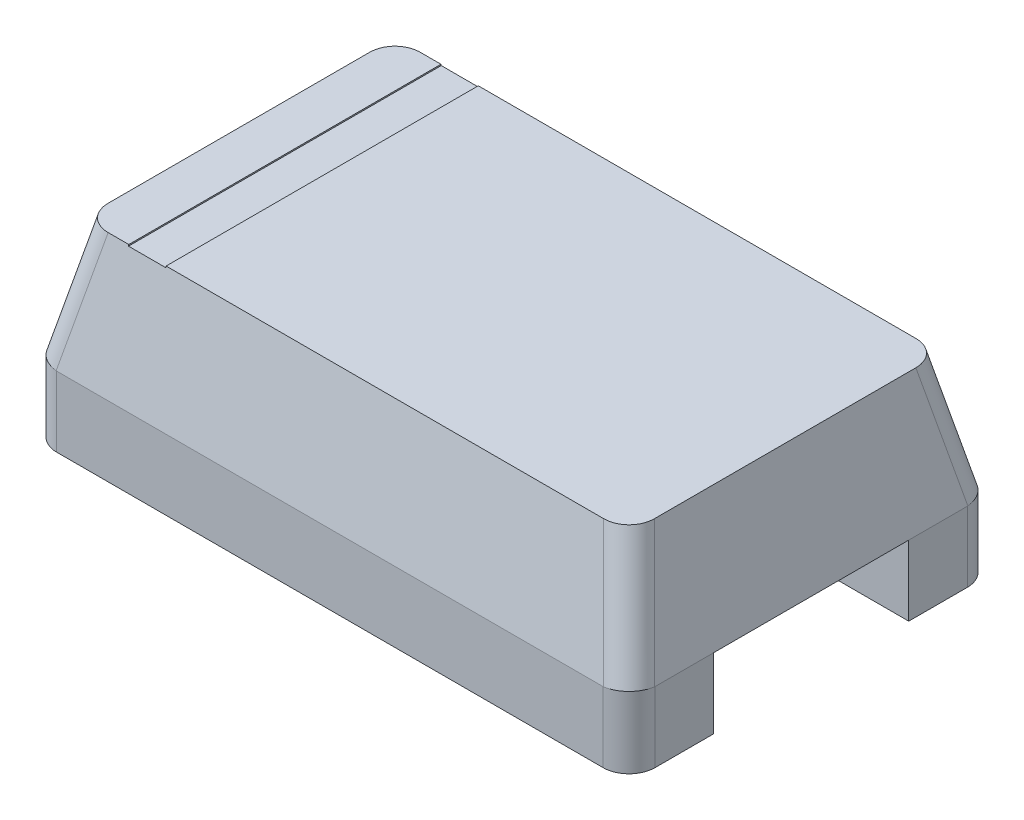
ISO-10303-21;
HEADER;
FILE_DESCRIPTION(('STEP AP214'),'2;1');
FILE_NAME('part.step','',(''),(''),'','','');
FILE_SCHEMA(('AUTOMOTIVE_DESIGN { 1 0 10303 214 1 1 1 1 }'));
ENDSEC;
DATA;
#1=APPLICATION_CONTEXT('core data for automotive mechanical design processes');
#2=APPLICATION_PROTOCOL_DEFINITION('international standard','automotive_design',2000,#1);
#3=PRODUCT_CONTEXT('',#1,'mechanical');
#4=PRODUCT('Part','Part','',(#3));
#5=PRODUCT_RELATED_PRODUCT_CATEGORY('part','',(#4));
#6=PRODUCT_DEFINITION_FORMATION('','',#4);
#7=PRODUCT_DEFINITION_CONTEXT('part definition',#1,'design');
#8=PRODUCT_DEFINITION('design','',#6,#7);
#9=PRODUCT_DEFINITION_SHAPE('','',#8);
#10=(LENGTH_UNIT() NAMED_UNIT(*) SI_UNIT(.MILLI.,.METRE.));
#11=(NAMED_UNIT(*) PLANE_ANGLE_UNIT() SI_UNIT($,.RADIAN.));
#12=(NAMED_UNIT(*) SI_UNIT($,.STERADIAN.) SOLID_ANGLE_UNIT());
#13=UNCERTAINTY_MEASURE_WITH_UNIT(LENGTH_MEASURE(1.E-05),#10,'distance_accuracy_value','');
#14=(GEOMETRIC_REPRESENTATION_CONTEXT(3) GLOBAL_UNCERTAINTY_ASSIGNED_CONTEXT((#13)) GLOBAL_UNIT_ASSIGNED_CONTEXT((#10,
#11,#12)) REPRESENTATION_CONTEXT('',''));
#15=CARTESIAN_POINT('',(0.,0.,0.));
#16=DIRECTION('',(0.,0.,1.));
#17=DIRECTION('',(1.,0.,0.));
#18=AXIS2_PLACEMENT_3D('',#15,#16,#17);
#19=CARTESIAN_POINT('',(5.08935,3.7056,1.104925));
#20=DIRECTION('',(0.,1.,0.));
#21=DIRECTION('',(1.,0.,0.));
#22=AXIS2_PLACEMENT_3D('',#19,#20,#21);
#23=PLANE('',#22);
#24=CARTESIAN_POINT('',(6.13935,3.7056,0.602642636392233));
#25=CARTESIAN_POINT('',(6.13935000000004,3.70559999999999,0.544878720635177));
#26=CARTESIAN_POINT('',(6.0993962793648,3.70559999999999,0.504924999999953));
#27=CARTESIAN_POINT('',(6.0416323636077,3.7056,0.504924999999953));
#28=(BOUNDED_CURVE() B_SPLINE_CURVE(3,(#24,#25,#26,#27),.UNSPECIFIED.,.F.,
.F.) B_SPLINE_CURVE_WITH_KNOTS((4,4),(2.37876533201006,3.90441997516953),
.UNSPECIFIED.) CURVE() GEOMETRIC_REPRESENTATION_ITEM() RATIONAL_B_SPLINE_CURVE((1.,
0.815256875860941,0.815256875860941,1.)) REPRESENTATION_ITEM(''));
#29=CARTESIAN_POINT('',(6.13935,3.7056,0.602642636392233));
#30=VERTEX_POINT('',#29);
#31=CARTESIAN_POINT('',(6.0416323636077,3.7056,0.504924999999953));
#32=VERTEX_POINT('',#31);
#33=EDGE_CURVE('E11',#30,#32,#28,.T.);
#34=ORIENTED_EDGE('',*,*,#33,.T.);
#35=DIRECTION('',(-1.,0.,0.));
#36=VECTOR('',#35,1.);
#37=CARTESIAN_POINT('',(5.08935,3.7056,0.504924999999953));
#38=LINE('',#37,#36);
#39=CARTESIAN_POINT('',(4.3597501776646,3.7056,0.504924999999953));
#40=VERTEX_POINT('',#39);
#41=EDGE_CURVE('E26',#32,#40,#38,.T.);
#42=ORIENTED_EDGE('',*,*,#41,.T.);
#43=DIRECTION('',(0.,0.,1.));
#44=VECTOR('',#43,1.);
#45=CARTESIAN_POINT('',(4.3597501776646,3.7056,1.104925));
#46=LINE('',#45,#44);
#47=CARTESIAN_POINT('',(4.3597501776646,3.7056,1.704925));
#48=VERTEX_POINT('',#47);
#49=EDGE_CURVE('E511',#40,#48,#46,.T.);
#50=ORIENTED_EDGE('',*,*,#49,.T.);
#51=DIRECTION('',(-1.,0.,0.));
#52=VECTOR('',#51,1.);
#53=CARTESIAN_POINT('',(3.93935,3.7056,1.704925));
#54=LINE('',#53,#52);
#55=CARTESIAN_POINT('',(6.0416323636077,3.7056,1.704925));
#56=VERTEX_POINT('',#55);
#57=EDGE_CURVE('E505',#56,#48,#54,.T.);
#58=ORIENTED_EDGE('',*,*,#57,.F.);
#59=CARTESIAN_POINT('',(6.0416323636077,3.7056,1.704925));
#60=CARTESIAN_POINT('',(6.0993962793648,3.70559999999999,1.70492499999998));
#61=CARTESIAN_POINT('',(6.13935000000004,3.70559999999999,1.66497127936475));
#62=CARTESIAN_POINT('',(6.13935,3.7056,1.6072073636077));
#63=(BOUNDED_CURVE() B_SPLINE_CURVE(3,(#59,#60,#61,#62),.UNSPECIFIED.,.F.,
.F.) B_SPLINE_CURVE_WITH_KNOTS((4,4),(2.37876533201006,3.90441997516953),
.UNSPECIFIED.) CURVE() GEOMETRIC_REPRESENTATION_ITEM() RATIONAL_B_SPLINE_CURVE((1.,
0.815256875860941,0.815256875860941,1.)) REPRESENTATION_ITEM(''));
#64=CARTESIAN_POINT('',(6.13935,3.7056,1.6072073636077));
#65=VERTEX_POINT('',#64);
#66=EDGE_CURVE('E501',#56,#65,#63,.T.);
#67=ORIENTED_EDGE('',*,*,#66,.T.);
#68=DIRECTION('',(0.,0.,-1.));
#69=VECTOR('',#68,1.);
#70=CARTESIAN_POINT('',(6.13935,3.7056,1.104925));
#71=LINE('',#70,#69);
#72=EDGE_CURVE('E499',#65,#30,#71,.T.);
#73=ORIENTED_EDGE('',*,*,#72,.T.);
#74=EDGE_LOOP('',(#34,#42,#50,#58,#67,#73));
#75=FACE_BOUND('',#74,.T.);
#76=ADVANCED_FACE('F17',(#75),#23,.T.);
#77=CARTESIAN_POINT('',(5.61435,3.7056,0.504924999999953));
#78=DIRECTION('',(0.,-0.212429644331044,0.977176363922801));
#79=DIRECTION('',(0.,-0.977176363922801,-0.212429644331044));
#80=AXIS2_PLACEMENT_3D('',#77,#78,#79);
#81=PLANE('',#80);
#82=DIRECTION('',(1.,0.,0.));
#83=VECTOR('',#82,1.);
#84=CARTESIAN_POINT('',(5.61435,3.2456,0.404924999999952));
#85=LINE('',#84,#83);
#86=CARTESIAN_POINT('',(4.03935,3.2456,0.404924999999952));
#87=VERTEX_POINT('',#86);
#88=CARTESIAN_POINT('',(6.13935,3.2456,0.404924999999952));
#89=VERTEX_POINT('',#88);
#90=EDGE_CURVE('E494',#87,#89,#85,.T.);
#91=ORIENTED_EDGE('',*,*,#90,.F.);
#92=CARTESIAN_POINT('',(4.0370931074559,3.2457171668928,0.404950471063605));
#93=CARTESIAN_POINT('',(4.03784529318196,3.24563905728904,0.404933490714961));
#94=CARTESIAN_POINT('',(4.0385976226354,3.24560000000003,0.404924999999952));
#95=CARTESIAN_POINT('',(4.03935,3.2456,0.404924999999952));
#96=(BOUNDED_CURVE() B_SPLINE_CURVE(3,(#92,#93,#94,#95),.UNSPECIFIED.,.F.,
.F.) B_SPLINE_CURVE_WITH_KNOTS((4,4),(3.11902181177206,3.14159265358979),
.UNSPECIFIED.) CURVE() GEOMETRIC_REPRESENTATION_ITEM() RATIONAL_B_SPLINE_CURVE((1.,
0.999957546875544,0.999957546875544,1.)) REPRESENTATION_ITEM(''));
#97=CARTESIAN_POINT('',(4.0370931074559,3.2457171668928,0.404950471063605));
#98=VERTEX_POINT('',#97);
#99=EDGE_CURVE('E489',#98,#87,#96,.T.);
#100=ORIENTED_EDGE('',*,*,#99,.F.);
#101=DIRECTION('',(-0.207792908730851,-0.955847380161889,-0.207792908730846));
#102=VECTOR('',#101,1.);
#103=CARTESIAN_POINT('',(4.1370676363923,3.7056,0.504924999999953));
#104=LINE('',#103,#102);
#105=CARTESIAN_POINT('',(4.1370676363923,3.7056,0.504924999999952));
#106=VERTEX_POINT('',#105);
#107=EDGE_CURVE('E486',#106,#98,#104,.T.);
#108=ORIENTED_EDGE('',*,*,#107,.F.);
#109=DIRECTION('',(-1.,0.,0.));
#110=VECTOR('',#109,1.);
#111=CARTESIAN_POINT('',(5.61435,3.7056,0.504924999999953));
#112=LINE('',#111,#110);
#113=CARTESIAN_POINT('',(4.2163599227639,3.7056,0.504924999999953));
#114=VERTEX_POINT('',#113);
#115=EDGE_CURVE('E483',#114,#106,#112,.T.);
#116=ORIENTED_EDGE('',*,*,#115,.F.);
#117=DIRECTION('',(0.,0.977176363922801,0.212429644331044));
#118=VECTOR('',#117,1.);
#119=CARTESIAN_POINT('',(4.2163599227639,3.7056,0.504924999999953));
#120=LINE('',#119,#118);
#121=CARTESIAN_POINT('',(4.2163599227639,3.7006,0.503838043478213));
#122=VERTEX_POINT('',#121);
#123=EDGE_CURVE('E480',#122,#114,#120,.T.);
#124=ORIENTED_EDGE('',*,*,#123,.F.);
#125=DIRECTION('',(-1.,0.,0.));
#126=VECTOR('',#125,1.);
#127=CARTESIAN_POINT('',(5.61435,3.7006,0.503838043478213));
#128=LINE('',#127,#126);
#129=CARTESIAN_POINT('',(4.3597501776646,3.7006,0.503838043478213));
#130=VERTEX_POINT('',#129);
#131=EDGE_CURVE('E477',#130,#122,#128,.T.);
#132=ORIENTED_EDGE('',*,*,#131,.F.);
#133=DIRECTION('',(0.,-0.977176363922801,-0.212429644331044));
#134=VECTOR('',#133,1.);
#135=CARTESIAN_POINT('',(4.3597501776646,3.7056,0.504924999999953));
#136=LINE('',#135,#134);
#137=EDGE_CURVE('E474',#40,#130,#136,.T.);
#138=ORIENTED_EDGE('',*,*,#137,.F.);
#139=ORIENTED_EDGE('',*,*,#41,.F.);
#140=DIRECTION('',(-0.207792908730851,0.955847380161889,0.207792908730846));
#141=VECTOR('',#140,1.);
#142=CARTESIAN_POINT('',(6.1416068925441,3.2457171668928,0.404950471063605));
#143=LINE('',#142,#141);
#144=CARTESIAN_POINT('',(6.1416068925441,3.2457171668928,0.404950471063605));
#145=VERTEX_POINT('',#144);
#146=EDGE_CURVE('E469',#145,#32,#143,.T.);
#147=ORIENTED_EDGE('',*,*,#146,.F.);
#148=CARTESIAN_POINT('',(6.13935,3.2456,0.404924999999952));
#149=CARTESIAN_POINT('',(6.1401023773646,3.24560000000003,0.404924999999952));
#150=CARTESIAN_POINT('',(6.14085470681803,3.24563905728904,0.404933490714961));
#151=CARTESIAN_POINT('',(6.1416068925441,3.2457171668928,0.404950471063605));
#152=(BOUNDED_CURVE() B_SPLINE_CURVE(3,(#148,#149,#150,#151),.UNSPECIFIED.,.F.,
.F.) B_SPLINE_CURVE_WITH_KNOTS((4,4),(3.14159265358979,3.16416349540752),
.UNSPECIFIED.) CURVE() GEOMETRIC_REPRESENTATION_ITEM() RATIONAL_B_SPLINE_CURVE((1.,
0.999957546875544,0.999957546875544,1.)) REPRESENTATION_ITEM(''));
#153=EDGE_CURVE('E464',#89,#145,#152,.T.);
#154=ORIENTED_EDGE('',*,*,#153,.F.);
#155=EDGE_LOOP('',(#91,#100,#108,#116,#124,#132,#138,#139,#147,#154));
#156=FACE_BOUND('',#155,.T.);
#157=ADVANCED_FACE('F519',(#156),#81,.F.);
#158=CARTESIAN_POINT('',(6.0150873565435,3.8064640680624,0.62918764345647));
#159=DIRECTION('',(-0.207792908730846,0.95584738016189,0.207792908730845));
#160=DIRECTION('',(0.977176363922801,0.212429644331044,0.));
#161=AXIS2_PLACEMENT_3D('',#158,#159,#160);
#162=CYLINDRICAL_SURFACE('',#161,0.0999999999999997);
#163=ORIENTED_EDGE('',*,*,#146,.T.);
#164=ORIENTED_EDGE('',*,*,#33,.F.);
#165=DIRECTION('',(0.207792908730846,-0.95584738016189,-0.207792908730845));
#166=VECTOR('',#165,1.);
#167=CARTESIAN_POINT('',(6.1128049929358,3.8277070324955,0.62918764345647));
#168=LINE('',#167,#166);
#169=CARTESIAN_POINT('',(6.2393245289363,3.2457171668928,0.502668107455886));
#170=VERTEX_POINT('',#169);
#171=EDGE_CURVE('E459',#30,#170,#168,.T.);
#172=ORIENTED_EDGE('',*,*,#171,.T.);
#173=CARTESIAN_POINT('',(6.2393245289363,3.2457171668928,0.502668107455886));
#174=CARTESIAN_POINT('',(6.23804931482998,3.25158315178215,0.446179405805221));
#175=CARTESIAN_POINT('',(6.19809559419475,3.25158315178215,0.406225685169997));
#176=CARTESIAN_POINT('',(6.1416068925441,3.2457171668928,0.404950471063605));
#177=(BOUNDED_CURVE() B_SPLINE_CURVE(3,(#173,#174,#175,#176),.UNSPECIFIED.,.F.,
.F.) B_SPLINE_CURVE_WITH_KNOTS((4,4),(2.37876533201005,3.90441997516951),
.UNSPECIFIED.) CURVE() GEOMETRIC_REPRESENTATION_ITEM() RATIONAL_B_SPLINE_CURVE((1.,
0.815256875860945,0.815256875860945,1.)) REPRESENTATION_ITEM(''));
#178=EDGE_CURVE('E451',#170,#145,#177,.T.);
#179=ORIENTED_EDGE('',*,*,#178,.T.);
#180=EDGE_LOOP('',(#163,#164,#172,#179));
#181=FACE_BOUND('',#180,.T.);
#182=ADVANCED_FACE('F540',(#181),#162,.T.);
#183=CARTESIAN_POINT('',(6.13935,3.7056,1.404925));
#184=DIRECTION('',(-0.977176363922801,-0.212429644331044,0.));
#185=DIRECTION('',(-0.212429644331044,0.977176363922801,0.));
#186=AXIS2_PLACEMENT_3D('',#183,#184,#185);
#187=PLANE('',#186);
#188=CARTESIAN_POINT('',(6.23935,3.2456,1.704925));
#189=CARTESIAN_POINT('',(6.23934999999997,3.24560000000003,1.70567737736458));
#190=CARTESIAN_POINT('',(6.23934150928501,3.24563905728904,1.70642970681792));
#191=CARTESIAN_POINT('',(6.2393245289363,3.2457171668928,1.707181892544));
#192=(BOUNDED_CURVE() B_SPLINE_CURVE(3,(#188,#189,#190,#191),.UNSPECIFIED.,.F.,
.F.) B_SPLINE_CURVE_WITH_KNOTS((4,4),(3.14159265358979,3.1641634954075),
.UNSPECIFIED.) CURVE() GEOMETRIC_REPRESENTATION_ITEM() RATIONAL_B_SPLINE_CURVE((1.,
0.999957546875545,0.999957546875545,1.)) REPRESENTATION_ITEM(''));
#193=CARTESIAN_POINT('',(6.23935,3.2456,1.704925));
#194=VERTEX_POINT('',#193);
#195=CARTESIAN_POINT('',(6.2393245289363,3.2457171668928,1.707181892544));
#196=VERTEX_POINT('',#195);
#197=EDGE_CURVE('E447',#194,#196,#192,.T.);
#198=ORIENTED_EDGE('',*,*,#197,.F.);
#199=DIRECTION('',(0.,0.,1.));
#200=VECTOR('',#199,1.);
#201=CARTESIAN_POINT('',(6.23935,3.2456,1.404925));
#202=LINE('',#201,#200);
#203=CARTESIAN_POINT('',(6.23935,3.2456,1.479925));
#204=VERTEX_POINT('',#203);
#205=EDGE_CURVE('E444',#204,#194,#202,.T.);
#206=ORIENTED_EDGE('',*,*,#205,.F.);
#207=DIRECTION('',(0.,0.,1.));
#208=VECTOR('',#207,1.);
#209=CARTESIAN_POINT('',(6.23935,3.2456,1.404925));
#210=LINE('',#209,#208);
#211=CARTESIAN_POINT('',(6.23935,3.2456,0.729924999999952));
#212=VERTEX_POINT('',#211);
#213=EDGE_CURVE('E441',#212,#204,#210,.T.);
#214=ORIENTED_EDGE('',*,*,#213,.F.);
#215=DIRECTION('',(0.,0.,1.));
#216=VECTOR('',#215,1.);
#217=CARTESIAN_POINT('',(6.23935,3.2456,1.404925));
#218=LINE('',#217,#216);
#219=CARTESIAN_POINT('',(6.23935,3.2456,0.504924999999952));
#220=VERTEX_POINT('',#219);
#221=EDGE_CURVE('E435',#220,#212,#218,.T.);
#222=ORIENTED_EDGE('',*,*,#221,.F.);
#223=CARTESIAN_POINT('',(6.2393245289363,3.2457171668928,0.502668107455886));
#224=CARTESIAN_POINT('',(6.23934150928501,3.24563905728904,0.503420293181948));
#225=CARTESIAN_POINT('',(6.23934999999997,3.24560000000003,0.504172622635373));
#226=CARTESIAN_POINT('',(6.23935,3.2456,0.504924999999952));
#227=(BOUNDED_CURVE() B_SPLINE_CURVE(3,(#223,#224,#225,#226),.UNSPECIFIED.,.F.,
.F.) B_SPLINE_CURVE_WITH_KNOTS((4,4),(3.11902181177209,3.14159265358979),
.UNSPECIFIED.) CURVE() GEOMETRIC_REPRESENTATION_ITEM() RATIONAL_B_SPLINE_CURVE((1.,
0.999957546875545,0.999957546875545,1.)) REPRESENTATION_ITEM(''));
#228=EDGE_CURVE('E430',#170,#220,#227,.T.);
#229=ORIENTED_EDGE('',*,*,#228,.F.);
#230=ORIENTED_EDGE('',*,*,#171,.F.);
#231=ORIENTED_EDGE('',*,*,#72,.F.);
#232=DIRECTION('',(-0.207792908730846,0.95584738016189,-0.207792908730845));
#233=VECTOR('',#232,1.);
#234=CARTESIAN_POINT('',(6.2393245289363,3.2457171668928,1.707181892544));
#235=LINE('',#234,#233);
#236=EDGE_CURVE('E427',#196,#65,#235,.T.);
#237=ORIENTED_EDGE('',*,*,#236,.F.);
#238=EDGE_LOOP('',(#198,#206,#214,#222,#229,#230,#231,#237));
#239=FACE_BOUND('',#238,.T.);
#240=ADVANCED_FACE('F536',(#239),#187,.F.);
#241=CARTESIAN_POINT('',(5.9918792390996,3.9132214083042,1.5574542390996));
#242=DIRECTION('',(-0.207792908730846,0.95584738016189,-0.207792908730846));
#243=DIRECTION('',(0.977176363922801,0.212429644331044,0.));
#244=AXIS2_PLACEMENT_3D('',#241,#242,#243);
#245=CYLINDRICAL_SURFACE('',#244,0.0999999999999996);
#246=ORIENTED_EDGE('',*,*,#236,.T.);
#247=ORIENTED_EDGE('',*,*,#66,.F.);
#248=DIRECTION('',(-0.207792908730851,0.955847380161889,-0.207792908730845));
#249=VECTOR('',#248,1.);
#250=CARTESIAN_POINT('',(6.1416068925441,3.2457171668928,1.8048995289363));
#251=LINE('',#250,#249);
#252=CARTESIAN_POINT('',(6.1416068925441,3.2457171668928,1.8048995289363));
#253=VERTEX_POINT('',#252);
#254=EDGE_CURVE('E421',#253,#56,#251,.T.);
#255=ORIENTED_EDGE('',*,*,#254,.F.);
#256=CARTESIAN_POINT('',(6.1416068925441,3.2457171668928,1.8048995289363));
#257=CARTESIAN_POINT('',(6.19809559419474,3.25158315178214,1.80362431482994));
#258=CARTESIAN_POINT('',(6.23804931482997,3.25158315178214,1.76367059419471));
#259=CARTESIAN_POINT('',(6.2393245289363,3.2457171668928,1.707181892544));
#260=(BOUNDED_CURVE() B_SPLINE_CURVE(3,(#256,#257,#258,#259),.UNSPECIFIED.,.F.,
.F.) B_SPLINE_CURVE_WITH_KNOTS((4,4),(2.37876533201008,3.90441997516953),
.UNSPECIFIED.) CURVE() GEOMETRIC_REPRESENTATION_ITEM() RATIONAL_B_SPLINE_CURVE((1.,
0.815256875860946,0.815256875860946,1.)) REPRESENTATION_ITEM(''));
#261=EDGE_CURVE('E416',#253,#196,#260,.T.);
#262=ORIENTED_EDGE('',*,*,#261,.T.);
#263=EDGE_LOOP('',(#246,#247,#255,#262));
#264=FACE_BOUND('',#263,.T.);
#265=ADVANCED_FACE('F532',(#264),#245,.T.);
#266=CARTESIAN_POINT('',(4.3597501776646,3.7056,1.104925));
#267=DIRECTION('',(-1.,0.,0.));
#268=DIRECTION('',(0.,1.,0.));
#269=AXIS2_PLACEMENT_3D('',#266,#267,#268);
#270=PLANE('',#269);
#271=DIRECTION('',(0.,0.,1.));
#272=VECTOR('',#271,1.);
#273=CARTESIAN_POINT('',(4.3597501776646,3.7006,1.104925));
#274=LINE('',#273,#272);
#275=CARTESIAN_POINT('',(4.3597501776646,3.7006,1.7060119565217));
#276=VERTEX_POINT('',#275);
#277=EDGE_CURVE('E414',#130,#276,#274,.T.);
#278=ORIENTED_EDGE('',*,*,#277,.T.);
#279=DIRECTION('',(0.,-0.977176363922801,0.212429644331044));
#280=VECTOR('',#279,1.);
#281=CARTESIAN_POINT('',(4.3597501776646,3.7056,1.704925));
#282=LINE('',#281,#280);
#283=EDGE_CURVE('E411',#48,#276,#282,.T.);
#284=ORIENTED_EDGE('',*,*,#283,.F.);
#285=ORIENTED_EDGE('',*,*,#49,.F.);
#286=ORIENTED_EDGE('',*,*,#137,.T.);
#287=EDGE_LOOP('',(#278,#284,#285,#286));
#288=FACE_BOUND('',#287,.T.);
#289=ADVANCED_FACE('F517',(#288),#270,.T.);
#290=CARTESIAN_POINT('',(6.13935,2.9756,0.504924999999953));
#291=DIRECTION('',(0.,1.,0.));
#292=DIRECTION('',(1.,0.,0.));
#293=AXIS2_PLACEMENT_3D('',#290,#291,#292);
#294=CYLINDRICAL_SURFACE('',#293,0.1);
#295=ORIENTED_EDGE('',*,*,#153,.T.);
#296=ORIENTED_EDGE('',*,*,#178,.F.);
#297=ORIENTED_EDGE('',*,*,#228,.T.);
#298=DIRECTION('',(0.,-1.,0.));
#299=VECTOR('',#298,1.);
#300=CARTESIAN_POINT('',(6.23935,2.9756,0.504924999999953));
#301=LINE('',#300,#299);
#302=CARTESIAN_POINT('',(6.23935,2.9756,0.504924999999953));
#303=VERTEX_POINT('',#302);
#304=EDGE_CURVE('E409',#220,#303,#301,.T.);
#305=ORIENTED_EDGE('',*,*,#304,.T.);
#306=CARTESIAN_POINT('',(6.13935,2.9756,0.504924999999953));
#307=DIRECTION('',(0.,1.,0.));
#308=DIRECTION('',(1.,0.,0.));
#309=AXIS2_PLACEMENT_3D('',#306,#307,#308);
#310=CIRCLE('',#309,0.1);
#311=CARTESIAN_POINT('',(6.13935,2.9756,0.404924999999952));
#312=VERTEX_POINT('',#311);
#313=EDGE_CURVE('E407',#303,#312,#310,.T.);
#314=ORIENTED_EDGE('',*,*,#313,.T.);
#315=DIRECTION('',(0.,1.,0.));
#316=VECTOR('',#315,1.);
#317=CARTESIAN_POINT('',(6.13935,2.9756,0.404924999999952));
#318=LINE('',#317,#316);
#319=EDGE_CURVE('E404',#312,#89,#318,.T.);
#320=ORIENTED_EDGE('',*,*,#319,.T.);
#321=EDGE_LOOP('',(#295,#296,#297,#305,#314,#320));
#322=FACE_BOUND('',#321,.T.);
#323=ADVANCED_FACE('F542',(#322),#294,.T.);
#324=CARTESIAN_POINT('',(5.08935,2.9756,0.404924999999952));
#325=DIRECTION('',(0.,0.,-1.));
#326=DIRECTION('',(0.,1.,0.));
#327=AXIS2_PLACEMENT_3D('',#324,#325,#326);
#328=PLANE('',#327);
#329=DIRECTION('',(0.,1.,0.));
#330=VECTOR('',#329,1.);
#331=CARTESIAN_POINT('',(4.03935,2.9756,0.404924999999952));
#332=LINE('',#331,#330);
#333=CARTESIAN_POINT('',(4.03935,2.9756,0.404924999999952));
#334=VERTEX_POINT('',#333);
#335=EDGE_CURVE('E401',#334,#87,#332,.T.);
#336=ORIENTED_EDGE('',*,*,#335,.T.);
#337=ORIENTED_EDGE('',*,*,#90,.T.);
#338=ORIENTED_EDGE('',*,*,#319,.F.);
#339=DIRECTION('',(-1.,0.,0.));
#340=VECTOR('',#339,1.);
#341=CARTESIAN_POINT('',(5.08935,2.9756,0.404924999999952));
#342=LINE('',#341,#340);
#343=EDGE_CURVE('E398',#312,#334,#342,.T.);
#344=ORIENTED_EDGE('',*,*,#343,.T.);
#345=EDGE_LOOP('',(#336,#337,#338,#344));
#346=FACE_BOUND('',#345,.T.);
#347=ADVANCED_FACE('F550',(#346),#328,.T.);
#348=CARTESIAN_POINT('',(4.03935,2.9756,0.504924999999953));
#349=DIRECTION('',(0.,1.,0.));
#350=DIRECTION('',(1.,0.,0.));
#351=AXIS2_PLACEMENT_3D('',#348,#349,#350);
#352=CYLINDRICAL_SURFACE('',#351,0.1);
#353=ORIENTED_EDGE('',*,*,#335,.F.);
#354=CARTESIAN_POINT('',(4.03935,2.9756,0.504924999999953));
#355=DIRECTION('',(0.,1.,0.));
#356=DIRECTION('',(1.,0.,0.));
#357=AXIS2_PLACEMENT_3D('',#354,#355,#356);
#358=CIRCLE('',#357,0.1);
#359=CARTESIAN_POINT('',(3.93935,2.9756,0.504924999999953));
#360=VERTEX_POINT('',#359);
#361=EDGE_CURVE('E396',#334,#360,#358,.T.);
#362=ORIENTED_EDGE('',*,*,#361,.T.);
#363=DIRECTION('',(0.,1.,0.));
#364=VECTOR('',#363,1.);
#365=CARTESIAN_POINT('',(3.93935,2.9756,0.504924999999953));
#366=LINE('',#365,#364);
#367=CARTESIAN_POINT('',(3.93935,3.2456,0.504924999999953));
#368=VERTEX_POINT('',#367);
#369=EDGE_CURVE('E391',#360,#368,#366,.T.);
#370=ORIENTED_EDGE('',*,*,#369,.T.);
#371=CARTESIAN_POINT('',(3.93935,3.2456,0.504924999999953));
#372=CARTESIAN_POINT('',(3.93935000000002,3.24560000000003,0.504172622635373));
#373=CARTESIAN_POINT('',(3.93935849071498,3.24563905728904,0.503420293181948));
#374=CARTESIAN_POINT('',(3.9393754710636,3.2457171668928,0.502668107455886));
#375=(BOUNDED_CURVE() B_SPLINE_CURVE(3,(#371,#372,#373,#374),.UNSPECIFIED.,.F.,
.F.) B_SPLINE_CURVE_WITH_KNOTS((4,4),(3.14159265358979,3.1641634954075),
.UNSPECIFIED.) CURVE() GEOMETRIC_REPRESENTATION_ITEM() RATIONAL_B_SPLINE_CURVE((1.,
0.999957546875545,0.999957546875545,1.)) REPRESENTATION_ITEM(''));
#376=CARTESIAN_POINT('',(3.9393754710636,3.2457171668928,0.502668107455886));
#377=VERTEX_POINT('',#376);
#378=EDGE_CURVE('E384',#368,#377,#375,.T.);
#379=ORIENTED_EDGE('',*,*,#378,.T.);
#380=CARTESIAN_POINT('',(3.9393754710636,3.2457171668928,0.502668107455886));
#381=CARTESIAN_POINT('',(3.94065068517002,3.25158315178215,0.446179405805221));
#382=CARTESIAN_POINT('',(3.98060440580525,3.25158315178215,0.406225685169997));
#383=CARTESIAN_POINT('',(4.0370931074559,3.2457171668928,0.404950471063605));
#384=(BOUNDED_CURVE() B_SPLINE_CURVE(3,(#380,#381,#382,#383),.UNSPECIFIED.,.F.,
.F.) B_SPLINE_CURVE_WITH_KNOTS((4,4),(5.52035798559984,7.04601262875931),
.UNSPECIFIED.) CURVE() GEOMETRIC_REPRESENTATION_ITEM() RATIONAL_B_SPLINE_CURVE((1.,
0.815256875860944,0.815256875860944,1.)) REPRESENTATION_ITEM(''));
#385=EDGE_CURVE('E379',#377,#98,#384,.T.);
#386=ORIENTED_EDGE('',*,*,#385,.T.);
#387=ORIENTED_EDGE('',*,*,#99,.T.);
#388=EDGE_LOOP('',(#353,#362,#370,#379,#386,#387));
#389=FACE_BOUND('',#388,.T.);
#390=ADVANCED_FACE('F548',(#389),#352,.T.);
#391=CARTESIAN_POINT('',(4.1733276693632,3.8511531872334,0.638902669363205));
#392=DIRECTION('',(0.207792908730846,0.95584738016189,0.207792908730846));
#393=DIRECTION('',(0.977176363922801,-0.212429644331044,0.));
#394=AXIS2_PLACEMENT_3D('',#391,#392,#393);
#395=CYLINDRICAL_SURFACE('',#394,0.0999999999999997);
#396=ORIENTED_EDGE('',*,*,#107,.T.);
#397=ORIENTED_EDGE('',*,*,#385,.F.);
#398=DIRECTION('',(0.207792908730846,0.95584738016189,0.207792908730846));
#399=VECTOR('',#398,1.);
#400=CARTESIAN_POINT('',(4.075610032971,3.8723961516665,0.638902669363206));
#401=LINE('',#400,#399);
#402=CARTESIAN_POINT('',(4.03935,3.7056,0.602642636392232));
#403=VERTEX_POINT('',#402);
#404=EDGE_CURVE('E374',#377,#403,#401,.T.);
#405=ORIENTED_EDGE('',*,*,#404,.T.);
#406=CARTESIAN_POINT('',(4.03935,3.7056,0.602642636392232));
#407=CARTESIAN_POINT('',(4.03935000000001,3.7056,0.544878720635176));
#408=CARTESIAN_POINT('',(4.07930372063524,3.7056,0.504924999999952));
#409=CARTESIAN_POINT('',(4.1370676363923,3.7056,0.504924999999952));
#410=(BOUNDED_CURVE() B_SPLINE_CURVE(3,(#406,#407,#408,#409),.UNSPECIFIED.,.F.,
.F.) B_SPLINE_CURVE_WITH_KNOTS((4,4),(2.37876533201005,3.90441997516953),
.UNSPECIFIED.) CURVE() GEOMETRIC_REPRESENTATION_ITEM() RATIONAL_B_SPLINE_CURVE((1.,
0.815256875860941,0.815256875860941,1.)) REPRESENTATION_ITEM(''));
#411=EDGE_CURVE('E366',#403,#106,#410,.T.);
#412=ORIENTED_EDGE('',*,*,#411,.T.);
#413=EDGE_LOOP('',(#396,#397,#405,#412));
#414=FACE_BOUND('',#413,.T.);
#415=ADVANCED_FACE('F567',(#414),#395,.T.);
#416=CARTESIAN_POINT('',(5.08935,3.7056,1.104925));
#417=DIRECTION('',(0.,1.,0.));
#418=DIRECTION('',(1.,0.,0.));
#419=AXIS2_PLACEMENT_3D('',#416,#417,#418);
#420=PLANE('',#419);
#421=CARTESIAN_POINT('',(4.03935,3.7056,1.6072073636077));
#422=CARTESIAN_POINT('',(4.03935,3.70559999999999,1.66497127936475));
#423=CARTESIAN_POINT('',(4.07930372063523,3.70559999999999,1.70492499999998));
#424=CARTESIAN_POINT('',(4.1370676363923,3.7056,1.704925));
#425=(BOUNDED_CURVE() B_SPLINE_CURVE(3,(#421,#422,#423,#424),.UNSPECIFIED.,.F.,
.F.) B_SPLINE_CURVE_WITH_KNOTS((4,4),(2.37876533201006,3.90441997516953),
.UNSPECIFIED.) CURVE() GEOMETRIC_REPRESENTATION_ITEM() RATIONAL_B_SPLINE_CURVE((1.,
0.815256875860942,0.815256875860942,1.)) REPRESENTATION_ITEM(''));
#426=CARTESIAN_POINT('',(4.03935,3.7056,1.6072073636077));
#427=VERTEX_POINT('',#426);
#428=CARTESIAN_POINT('',(4.1370676363923,3.7056,1.704925));
#429=VERTEX_POINT('',#428);
#430=EDGE_CURVE('E362',#427,#429,#425,.T.);
#431=ORIENTED_EDGE('',*,*,#430,.T.);
#432=DIRECTION('',(-1.,0.,0.));
#433=VECTOR('',#432,1.);
#434=CARTESIAN_POINT('',(3.93935,3.7056,1.704925));
#435=LINE('',#434,#433);
#436=CARTESIAN_POINT('',(4.2163599227639,3.7056,1.704925));
#437=VERTEX_POINT('',#436);
#438=EDGE_CURVE('E359',#437,#429,#435,.T.);
#439=ORIENTED_EDGE('',*,*,#438,.F.);
#440=DIRECTION('',(0.,0.,-1.));
#441=VECTOR('',#440,1.);
#442=CARTESIAN_POINT('',(4.2163599227639,3.7056,1.104925));
#443=LINE('',#442,#441);
#444=EDGE_CURVE('E356',#437,#114,#443,.T.);
#445=ORIENTED_EDGE('',*,*,#444,.T.);
#446=ORIENTED_EDGE('',*,*,#115,.T.);
#447=ORIENTED_EDGE('',*,*,#411,.F.);
#448=DIRECTION('',(0.,0.,1.));
#449=VECTOR('',#448,1.);
#450=CARTESIAN_POINT('',(4.03935,3.7056,1.104925));
#451=LINE('',#450,#449);
#452=EDGE_CURVE('E353',#403,#427,#451,.T.);
#453=ORIENTED_EDGE('',*,*,#452,.T.);
#454=EDGE_LOOP('',(#431,#439,#445,#446,#447,#453));
#455=FACE_BOUND('',#454,.T.);
#456=ADVANCED_FACE('F570',(#455),#420,.T.);
#457=CARTESIAN_POINT('',(4.2163599227639,3.7056,1.104925));
#458=DIRECTION('',(1.,0.,0.));
#459=DIRECTION('',(0.,-1.,0.));
#460=AXIS2_PLACEMENT_3D('',#457,#458,#459);
#461=PLANE('',#460);
#462=DIRECTION('',(0.,0.,-1.));
#463=VECTOR('',#462,1.);
#464=CARTESIAN_POINT('',(4.2163599227639,3.7006,1.104925));
#465=LINE('',#464,#463);
#466=CARTESIAN_POINT('',(4.2163599227639,3.7006,1.7060119565217));
#467=VERTEX_POINT('',#466);
#468=EDGE_CURVE('E350',#467,#122,#465,.T.);
#469=ORIENTED_EDGE('',*,*,#468,.T.);
#470=ORIENTED_EDGE('',*,*,#123,.T.);
#471=ORIENTED_EDGE('',*,*,#444,.F.);
#472=DIRECTION('',(0.,0.977176363922801,-0.212429644331044));
#473=VECTOR('',#472,1.);
#474=CARTESIAN_POINT('',(4.2163599227639,3.7056,1.704925));
#475=LINE('',#474,#473);
#476=EDGE_CURVE('E347',#467,#437,#475,.T.);
#477=ORIENTED_EDGE('',*,*,#476,.F.);
#478=EDGE_LOOP('',(#469,#470,#471,#477));
#479=FACE_BOUND('',#478,.T.);
#480=ADVANCED_FACE('F525',(#479),#461,.T.);
#481=CARTESIAN_POINT('',(5.08935,3.7006,1.104925));
#482=DIRECTION('',(0.,1.,0.));
#483=DIRECTION('',(1.,0.,0.));
#484=AXIS2_PLACEMENT_3D('',#481,#482,#483);
#485=PLANE('',#484);
#486=ORIENTED_EDGE('',*,*,#277,.F.);
#487=ORIENTED_EDGE('',*,*,#131,.T.);
#488=ORIENTED_EDGE('',*,*,#468,.F.);
#489=DIRECTION('',(-1.,0.,0.));
#490=VECTOR('',#489,1.);
#491=CARTESIAN_POINT('',(3.93935,3.7006,1.7060119565217));
#492=LINE('',#491,#490);
#493=EDGE_CURVE('E341',#276,#467,#492,.T.);
#494=ORIENTED_EDGE('',*,*,#493,.F.);
#495=EDGE_LOOP('',(#486,#487,#488,#494));
#496=FACE_BOUND('',#495,.T.);
#497=ADVANCED_FACE('F521',(#496),#485,.T.);
#498=CARTESIAN_POINT('',(6.13935,2.9756,1.704925));
#499=DIRECTION('',(0.,1.,0.));
#500=DIRECTION('',(1.,0.,0.));
#501=AXIS2_PLACEMENT_3D('',#498,#499,#500);
#502=CYLINDRICAL_SURFACE('',#501,0.1);
#503=ORIENTED_EDGE('',*,*,#197,.T.);
#504=ORIENTED_EDGE('',*,*,#261,.F.);
#505=CARTESIAN_POINT('',(6.13935,3.2456,1.804925));
#506=CARTESIAN_POINT('',(6.1401023773646,3.24560000000003,1.80492499999996));
#507=CARTESIAN_POINT('',(6.14085470681803,3.24563905728904,1.8049165092849));
#508=CARTESIAN_POINT('',(6.1416068925441,3.2457171668928,1.8048995289363));
#509=(BOUNDED_CURVE() B_SPLINE_CURVE(3,(#505,#506,#507,#508),.UNSPECIFIED.,.F.,
.F.) B_SPLINE_CURVE_WITH_KNOTS((4,4),(3.14159265358979,3.16416349540752),
.UNSPECIFIED.) CURVE() GEOMETRIC_REPRESENTATION_ITEM() RATIONAL_B_SPLINE_CURVE((1.,
0.999957546875544,0.999957546875544,1.)) REPRESENTATION_ITEM(''));
#510=CARTESIAN_POINT('',(6.13935,3.2456,1.804925));
#511=VERTEX_POINT('',#510);
#512=EDGE_CURVE('E336',#511,#253,#509,.T.);
#513=ORIENTED_EDGE('',*,*,#512,.F.);
#514=DIRECTION('',(0.,1.,0.));
#515=VECTOR('',#514,1.);
#516=CARTESIAN_POINT('',(6.13935,2.9756,1.804925));
#517=LINE('',#516,#515);
#518=CARTESIAN_POINT('',(6.13935,2.9756,1.804925));
#519=VERTEX_POINT('',#518);
#520=EDGE_CURVE('E333',#519,#511,#517,.T.);
#521=ORIENTED_EDGE('',*,*,#520,.F.);
#522=CARTESIAN_POINT('',(6.13935,2.9756,1.704925));
#523=DIRECTION('',(0.,1.,0.));
#524=DIRECTION('',(1.,0.,0.));
#525=AXIS2_PLACEMENT_3D('',#522,#523,#524);
#526=CIRCLE('',#525,0.1);
#527=CARTESIAN_POINT('',(6.23935,2.9756,1.704925));
#528=VERTEX_POINT('',#527);
#529=EDGE_CURVE('E331',#519,#528,#526,.T.);
#530=ORIENTED_EDGE('',*,*,#529,.T.);
#531=DIRECTION('',(0.,1.,0.));
#532=VECTOR('',#531,1.);
#533=CARTESIAN_POINT('',(6.23935,2.9756,1.704925));
#534=LINE('',#533,#532);
#535=EDGE_CURVE('E328',#528,#194,#534,.T.);
#536=ORIENTED_EDGE('',*,*,#535,.T.);
#537=EDGE_LOOP('',(#503,#504,#513,#521,#530,#536));
#538=FACE_BOUND('',#537,.T.);
#539=ADVANCED_FACE('F585',(#538),#502,.T.);
#540=CARTESIAN_POINT('',(6.23935,2.9756,1.104925));
#541=DIRECTION('',(1.,0.,0.));
#542=DIRECTION('',(0.,-1.,0.));
#543=AXIS2_PLACEMENT_3D('',#540,#541,#542);
#544=PLANE('',#543);
#545=DIRECTION('',(0.,1.,0.));
#546=VECTOR('',#545,1.);
#547=CARTESIAN_POINT('',(6.23935,2.9756,1.479925));
#548=LINE('',#547,#546);
#549=CARTESIAN_POINT('',(6.23935,2.9756,1.479925));
#550=VERTEX_POINT('',#549);
#551=EDGE_CURVE('E325',#550,#204,#548,.T.);
#552=ORIENTED_EDGE('',*,*,#551,.T.);
#553=ORIENTED_EDGE('',*,*,#205,.T.);
#554=ORIENTED_EDGE('',*,*,#535,.F.);
#555=DIRECTION('',(0.,0.,-1.));
#556=VECTOR('',#555,1.);
#557=CARTESIAN_POINT('',(6.23935,2.9756,1.104925));
#558=LINE('',#557,#556);
#559=EDGE_CURVE('E322',#528,#550,#558,.T.);
#560=ORIENTED_EDGE('',*,*,#559,.T.);
#561=EDGE_LOOP('',(#552,#553,#554,#560));
#562=FACE_BOUND('',#561,.T.);
#563=ADVANCED_FACE('F591',(#562),#544,.T.);
#564=CARTESIAN_POINT('',(4.48935,3.2456,1.104925));
#565=DIRECTION('',(0.,1.,0.));
#566=DIRECTION('',(1.,0.,0.));
#567=AXIS2_PLACEMENT_3D('',#564,#565,#566);
#568=PLANE('',#567);
#569=DIRECTION('',(1.,0.,0.));
#570=VECTOR('',#569,1.);
#571=CARTESIAN_POINT('',(4.48935,3.2456,1.479925));
#572=LINE('',#571,#570);
#573=CARTESIAN_POINT('',(5.68935,3.2456,1.479925));
#574=VERTEX_POINT('',#573);
#575=EDGE_CURVE('E319',#574,#204,#572,.T.);
#576=ORIENTED_EDGE('',*,*,#575,.F.);
#577=DIRECTION('',(0.,0.,1.));
#578=VECTOR('',#577,1.);
#579=CARTESIAN_POINT('',(5.68935,3.2456,1.104925));
#580=LINE('',#579,#578);
#581=CARTESIAN_POINT('',(5.68935,3.2456,0.729924999999953));
#582=VERTEX_POINT('',#581);
#583=EDGE_CURVE('E316',#582,#574,#580,.T.);
#584=ORIENTED_EDGE('',*,*,#583,.F.);
#585=DIRECTION('',(-1.,0.,0.));
#586=VECTOR('',#585,1.);
#587=CARTESIAN_POINT('',(4.48935,3.2456,0.729924999999953));
#588=LINE('',#587,#586);
#589=EDGE_CURVE('E313',#212,#582,#588,.T.);
#590=ORIENTED_EDGE('',*,*,#589,.F.);
#591=ORIENTED_EDGE('',*,*,#213,.T.);
#592=EDGE_LOOP('',(#576,#584,#590,#591));
#593=FACE_BOUND('',#592,.T.);
#594=ADVANCED_FACE('F594',(#593),#568,.F.);
#595=CARTESIAN_POINT('',(6.23935,2.9756,1.104925));
#596=DIRECTION('',(1.,0.,0.));
#597=DIRECTION('',(0.,-1.,0.));
#598=AXIS2_PLACEMENT_3D('',#595,#596,#597);
#599=PLANE('',#598);
#600=DIRECTION('',(0.,-1.,0.));
#601=VECTOR('',#600,1.);
#602=CARTESIAN_POINT('',(6.23935,2.9756,0.729924999999952));
#603=LINE('',#602,#601);
#604=CARTESIAN_POINT('',(6.23935,2.9756,0.729924999999952));
#605=VERTEX_POINT('',#604);
#606=EDGE_CURVE('E311',#212,#605,#603,.T.);
#607=ORIENTED_EDGE('',*,*,#606,.T.);
#608=DIRECTION('',(0.,0.,-1.));
#609=VECTOR('',#608,1.);
#610=CARTESIAN_POINT('',(6.23935,2.9756,1.104925));
#611=LINE('',#610,#609);
#612=EDGE_CURVE('E308',#605,#303,#611,.T.);
#613=ORIENTED_EDGE('',*,*,#612,.T.);
#614=ORIENTED_EDGE('',*,*,#304,.F.);
#615=ORIENTED_EDGE('',*,*,#221,.T.);
#616=EDGE_LOOP('',(#607,#613,#614,#615));
#617=FACE_BOUND('',#616,.T.);
#618=ADVANCED_FACE('F601',(#617),#599,.T.);
#619=CARTESIAN_POINT('',(5.08935,2.9756,1.104925));
#620=DIRECTION('',(0.,1.,0.));
#621=DIRECTION('',(1.,0.,0.));
#622=AXIS2_PLACEMENT_3D('',#619,#620,#621);
#623=PLANE('',#622);
#624=DIRECTION('',(0.,0.,1.));
#625=VECTOR('',#624,1.);
#626=CARTESIAN_POINT('',(3.93935,2.9756,1.104925));
#627=LINE('',#626,#625);
#628=CARTESIAN_POINT('',(3.93935,2.9756,1.594925));
#629=VERTEX_POINT('',#628);
#630=CARTESIAN_POINT('',(3.93935,2.9756,1.704925));
#631=VERTEX_POINT('',#630);
#632=EDGE_CURVE('E306',#629,#631,#627,.T.);
#633=ORIENTED_EDGE('',*,*,#632,.F.);
#634=DIRECTION('',(-1.,0.,0.));
#635=VECTOR('',#634,1.);
#636=CARTESIAN_POINT('',(5.08935,2.9756,1.594925));
#637=LINE('',#636,#635);
#638=CARTESIAN_POINT('',(5.23935,2.9756,1.594925));
#639=VERTEX_POINT('',#638);
#640=EDGE_CURVE('E303',#639,#629,#637,.T.);
#641=ORIENTED_EDGE('',*,*,#640,.F.);
#642=DIRECTION('',(0.,0.,1.));
#643=VECTOR('',#642,1.);
#644=CARTESIAN_POINT('',(5.23935,2.9756,1.104925));
#645=LINE('',#644,#643);
#646=CARTESIAN_POINT('',(5.23935,2.9756,0.614924999999952));
#647=VERTEX_POINT('',#646);
#648=EDGE_CURVE('E301',#647,#639,#645,.T.);
#649=ORIENTED_EDGE('',*,*,#648,.F.);
#650=DIRECTION('',(1.,0.,0.));
#651=VECTOR('',#650,1.);
#652=CARTESIAN_POINT('',(5.08935,2.9756,0.614924999999952));
#653=LINE('',#652,#651);
#654=CARTESIAN_POINT('',(3.93935,2.9756,0.614924999999952));
#655=VERTEX_POINT('',#654);
#656=EDGE_CURVE('E207',#655,#647,#653,.T.);
#657=ORIENTED_EDGE('',*,*,#656,.F.);
#658=DIRECTION('',(0.,0.,1.));
#659=VECTOR('',#658,1.);
#660=CARTESIAN_POINT('',(3.93935,2.9756,1.104925));
#661=LINE('',#660,#659);
#662=EDGE_CURVE('E297',#360,#655,#661,.T.);
#663=ORIENTED_EDGE('',*,*,#662,.F.);
#664=ORIENTED_EDGE('',*,*,#361,.F.);
#665=ORIENTED_EDGE('',*,*,#343,.F.);
#666=ORIENTED_EDGE('',*,*,#313,.F.);
#667=ORIENTED_EDGE('',*,*,#612,.F.);
#668=DIRECTION('',(1.,0.,0.));
#669=VECTOR('',#668,1.);
#670=CARTESIAN_POINT('',(5.08935,2.9756,0.729924999999952));
#671=LINE('',#670,#669);
#672=CARTESIAN_POINT('',(5.68935,2.9756,0.729924999999952));
#673=VERTEX_POINT('',#672);
#674=EDGE_CURVE('E294',#673,#605,#671,.T.);
#675=ORIENTED_EDGE('',*,*,#674,.F.);
#676=DIRECTION('',(0.,0.,-1.));
#677=VECTOR('',#676,1.);
#678=CARTESIAN_POINT('',(5.68935,2.9756,1.104925));
#679=LINE('',#678,#677);
#680=CARTESIAN_POINT('',(5.68935,2.9756,1.479925));
#681=VERTEX_POINT('',#680);
#682=EDGE_CURVE('E291',#681,#673,#679,.T.);
#683=ORIENTED_EDGE('',*,*,#682,.F.);
#684=DIRECTION('',(-1.,0.,0.));
#685=VECTOR('',#684,1.);
#686=CARTESIAN_POINT('',(5.08935,2.9756,1.479925));
#687=LINE('',#686,#685);
#688=EDGE_CURVE('E288',#550,#681,#687,.T.);
#689=ORIENTED_EDGE('',*,*,#688,.F.);
#690=ORIENTED_EDGE('',*,*,#559,.F.);
#691=ORIENTED_EDGE('',*,*,#529,.F.);
#692=DIRECTION('',(1.,0.,0.));
#693=VECTOR('',#692,1.);
#694=CARTESIAN_POINT('',(5.08935,2.9756,1.804925));
#695=LINE('',#694,#693);
#696=CARTESIAN_POINT('',(4.03935,2.9756,1.804925));
#697=VERTEX_POINT('',#696);
#698=EDGE_CURVE('E285',#697,#519,#695,.T.);
#699=ORIENTED_EDGE('',*,*,#698,.F.);
#700=CARTESIAN_POINT('',(4.03935,2.9756,1.704925));
#701=DIRECTION('',(0.,1.,0.));
#702=DIRECTION('',(1.,0.,0.));
#703=AXIS2_PLACEMENT_3D('',#700,#701,#702);
#704=CIRCLE('',#703,0.1);
#705=EDGE_CURVE('E282',#631,#697,#704,.T.);
#706=ORIENTED_EDGE('',*,*,#705,.F.);
#707=EDGE_LOOP('',(#633,#641,#649,#657,#663,#664,#665,#666,#667,#675,#683,#689,#690,#691,#699,#706));
#708=FACE_BOUND('',#707,.T.);
#709=ADVANCED_FACE('F556',(#708),#623,.F.);
#710=CARTESIAN_POINT('',(4.1501195519194,3.7443958469916,1.5941554480806));
#711=DIRECTION('',(0.207792908730846,0.95584738016189,-0.207792908730846));
#712=DIRECTION('',(0.977176363922801,-0.212429644331044,0.));
#713=AXIS2_PLACEMENT_3D('',#710,#711,#712);
#714=CYLINDRICAL_SURFACE('',#713,0.0999999999999997);
#715=DIRECTION('',(-0.207792908730851,-0.955847380161889,0.207792908730845));
#716=VECTOR('',#715,1.);
#717=CARTESIAN_POINT('',(4.1370676363923,3.7056,1.704925));
#718=LINE('',#717,#716);
#719=CARTESIAN_POINT('',(4.0370931074559,3.2457171668928,1.8048995289363));
#720=VERTEX_POINT('',#719);
#721=EDGE_CURVE('E280',#429,#720,#718,.T.);
#722=ORIENTED_EDGE('',*,*,#721,.F.);
#723=ORIENTED_EDGE('',*,*,#430,.F.);
#724=DIRECTION('',(-0.207792908730846,-0.95584738016189,0.207792908730846));
#725=VECTOR('',#724,1.);
#726=CARTESIAN_POINT('',(4.0524019155271,3.7656388114247,1.5941554480806));
#727=LINE('',#726,#725);
#728=CARTESIAN_POINT('',(3.9393754710636,3.2457171668928,1.707181892544));
#729=VERTEX_POINT('',#728);
#730=EDGE_CURVE('E275',#427,#729,#727,.T.);
#731=ORIENTED_EDGE('',*,*,#730,.T.);
#732=CARTESIAN_POINT('',(3.9393754710636,3.2457171668928,1.707181892544));
#733=CARTESIAN_POINT('',(3.94065068517002,3.25158315178215,1.76367059419472));
#734=CARTESIAN_POINT('',(3.98060440580525,3.25158315178215,1.80362431482995));
#735=CARTESIAN_POINT('',(4.0370931074559,3.2457171668928,1.8048995289363));
#736=(BOUNDED_CURVE() B_SPLINE_CURVE(3,(#732,#733,#734,#735),.UNSPECIFIED.,.F.,
.F.) B_SPLINE_CURVE_WITH_KNOTS((4,4),(2.37876533201006,3.90441997516952),
.UNSPECIFIED.) CURVE() GEOMETRIC_REPRESENTATION_ITEM() RATIONAL_B_SPLINE_CURVE((1.,
0.815256875860944,0.815256875860944,1.)) REPRESENTATION_ITEM(''));
#737=EDGE_CURVE('E270',#729,#720,#736,.T.);
#738=ORIENTED_EDGE('',*,*,#737,.T.);
#739=EDGE_LOOP('',(#722,#723,#731,#738));
#740=FACE_BOUND('',#739,.T.);
#741=ADVANCED_FACE('F574',(#740),#714,.T.);
#742=CARTESIAN_POINT('',(4.03935,3.7056,0.804924999999953));
#743=DIRECTION('',(0.977176363922801,-0.212429644331044,0.));
#744=DIRECTION('',(-0.212429644331044,-0.977176363922801,0.));
#745=AXIS2_PLACEMENT_3D('',#742,#743,#744);
#746=PLANE('',#745);
#747=ORIENTED_EDGE('',*,*,#730,.F.);
#748=ORIENTED_EDGE('',*,*,#452,.F.);
#749=ORIENTED_EDGE('',*,*,#404,.F.);
#750=ORIENTED_EDGE('',*,*,#378,.F.);
#751=DIRECTION('',(0.,0.,-1.));
#752=VECTOR('',#751,1.);
#753=CARTESIAN_POINT('',(3.93935,3.2456,0.804924999999952));
#754=LINE('',#753,#752);
#755=CARTESIAN_POINT('',(3.93935,3.2456,0.614924999999952));
#756=VERTEX_POINT('',#755);
#757=EDGE_CURVE('E267',#756,#368,#754,.T.);
#758=ORIENTED_EDGE('',*,*,#757,.F.);
#759=DIRECTION('',(0.,0.,-1.));
#760=VECTOR('',#759,1.);
#761=CARTESIAN_POINT('',(3.93935,3.2456,0.804924999999952));
#762=LINE('',#761,#760);
#763=CARTESIAN_POINT('',(3.93935,3.2456,1.594925));
#764=VERTEX_POINT('',#763);
#765=EDGE_CURVE('E222',#764,#756,#762,.T.);
#766=ORIENTED_EDGE('',*,*,#765,.F.);
#767=DIRECTION('',(0.,0.,-1.));
#768=VECTOR('',#767,1.);
#769=CARTESIAN_POINT('',(3.93935,3.2456,0.804924999999952));
#770=LINE('',#769,#768);
#771=CARTESIAN_POINT('',(3.93935,3.2456,1.704925));
#772=VERTEX_POINT('',#771);
#773=EDGE_CURVE('E260',#772,#764,#770,.T.);
#774=ORIENTED_EDGE('',*,*,#773,.F.);
#775=CARTESIAN_POINT('',(3.9393754710636,3.2457171668928,1.707181892544));
#776=CARTESIAN_POINT('',(3.93935849071498,3.24563905728904,1.70642970681792));
#777=CARTESIAN_POINT('',(3.93935000000002,3.24560000000003,1.70567737736458));
#778=CARTESIAN_POINT('',(3.93935,3.2456,1.704925));
#779=(BOUNDED_CURVE() B_SPLINE_CURVE(3,(#775,#776,#777,#778),.UNSPECIFIED.,.F.,
.F.) B_SPLINE_CURVE_WITH_KNOTS((4,4),(3.11902181177208,3.14159265358979),
.UNSPECIFIED.) CURVE() GEOMETRIC_REPRESENTATION_ITEM() RATIONAL_B_SPLINE_CURVE((1.,
0.999957546875545,0.999957546875545,1.)) REPRESENTATION_ITEM(''));
#780=EDGE_CURVE('E255',#729,#772,#779,.T.);
#781=ORIENTED_EDGE('',*,*,#780,.F.);
#782=EDGE_LOOP('',(#747,#748,#749,#750,#758,#766,#774,#781));
#783=FACE_BOUND('',#782,.T.);
#784=ADVANCED_FACE('F563',(#783),#746,.F.);
#785=CARTESIAN_POINT('',(6.06435,2.9756,1.479925));
#786=DIRECTION('',(0.,0.,1.));
#787=DIRECTION('',(0.,-1.,0.));
#788=AXIS2_PLACEMENT_3D('',#785,#786,#787);
#789=PLANE('',#788);
#790=ORIENTED_EDGE('',*,*,#688,.T.);
#791=DIRECTION('',(0.,-1.,0.));
#792=VECTOR('',#791,1.);
#793=CARTESIAN_POINT('',(5.68935,2.9756,1.479925));
#794=LINE('',#793,#792);
#795=EDGE_CURVE('E252',#574,#681,#794,.T.);
#796=ORIENTED_EDGE('',*,*,#795,.F.);
#797=ORIENTED_EDGE('',*,*,#575,.T.);
#798=ORIENTED_EDGE('',*,*,#551,.F.);
#799=EDGE_LOOP('',(#790,#796,#797,#798));
#800=FACE_BOUND('',#799,.T.);
#801=ADVANCED_FACE('F606',(#800),#789,.F.);
#802=CARTESIAN_POINT('',(5.68935,2.9756,1.104925));
#803=DIRECTION('',(-1.,0.,0.));
#804=DIRECTION('',(0.,1.,0.));
#805=AXIS2_PLACEMENT_3D('',#802,#803,#804);
#806=PLANE('',#805);
#807=ORIENTED_EDGE('',*,*,#795,.T.);
#808=ORIENTED_EDGE('',*,*,#682,.T.);
#809=DIRECTION('',(0.,-1.,0.));
#810=VECTOR('',#809,1.);
#811=CARTESIAN_POINT('',(5.68935,2.9756,0.729924999999952));
#812=LINE('',#811,#810);
#813=EDGE_CURVE('E249',#582,#673,#812,.T.);
#814=ORIENTED_EDGE('',*,*,#813,.F.);
#815=ORIENTED_EDGE('',*,*,#583,.T.);
#816=EDGE_LOOP('',(#807,#808,#814,#815));
#817=FACE_BOUND('',#816,.T.);
#818=ADVANCED_FACE('F603',(#817),#806,.F.);
#819=CARTESIAN_POINT('',(6.06435,2.9756,0.729924999999953));
#820=DIRECTION('',(0.,0.,-1.));
#821=DIRECTION('',(0.,1.,0.));
#822=AXIS2_PLACEMENT_3D('',#819,#820,#821);
#823=PLANE('',#822);
#824=ORIENTED_EDGE('',*,*,#589,.T.);
#825=ORIENTED_EDGE('',*,*,#813,.T.);
#826=ORIENTED_EDGE('',*,*,#674,.T.);
#827=ORIENTED_EDGE('',*,*,#606,.F.);
#828=EDGE_LOOP('',(#824,#825,#826,#827));
#829=FACE_BOUND('',#828,.T.);
#830=ADVANCED_FACE('F598',(#829),#823,.F.);
#831=CARTESIAN_POINT('',(4.03935,2.9756,1.704925));
#832=DIRECTION('',(0.,1.,0.));
#833=DIRECTION('',(1.,0.,0.));
#834=AXIS2_PLACEMENT_3D('',#831,#832,#833);
#835=CYLINDRICAL_SURFACE('',#834,0.1);
#836=DIRECTION('',(0.,-1.,0.));
#837=VECTOR('',#836,1.);
#838=CARTESIAN_POINT('',(3.93935,2.9756,1.704925));
#839=LINE('',#838,#837);
#840=EDGE_CURVE('E246',#772,#631,#839,.T.);
#841=ORIENTED_EDGE('',*,*,#840,.T.);
#842=ORIENTED_EDGE('',*,*,#705,.T.);
#843=DIRECTION('',(0.,-1.,0.));
#844=VECTOR('',#843,1.);
#845=CARTESIAN_POINT('',(4.03935,2.9756,1.804925));
#846=LINE('',#845,#844);
#847=CARTESIAN_POINT('',(4.03935,3.2456,1.804925));
#848=VERTEX_POINT('',#847);
#849=EDGE_CURVE('E240',#848,#697,#846,.T.);
#850=ORIENTED_EDGE('',*,*,#849,.F.);
#851=CARTESIAN_POINT('',(4.03935,3.2456,1.804925));
#852=CARTESIAN_POINT('',(4.0385976226354,3.24560000000003,1.80492499999996));
#853=CARTESIAN_POINT('',(4.03784529318196,3.24563905728904,1.8049165092849));
#854=CARTESIAN_POINT('',(4.0370931074559,3.2457171668928,1.8048995289363));
#855=(BOUNDED_CURVE() B_SPLINE_CURVE(3,(#851,#852,#853,#854),.UNSPECIFIED.,.F.,
.F.) B_SPLINE_CURVE_WITH_KNOTS((4,4),(3.14159265358979,3.16416349540751),
.UNSPECIFIED.) CURVE() GEOMETRIC_REPRESENTATION_ITEM() RATIONAL_B_SPLINE_CURVE((1.,
0.999957546875544,0.999957546875544,1.)) REPRESENTATION_ITEM(''));
#856=EDGE_CURVE('E235',#848,#720,#855,.T.);
#857=ORIENTED_EDGE('',*,*,#856,.T.);
#858=ORIENTED_EDGE('',*,*,#737,.F.);
#859=ORIENTED_EDGE('',*,*,#780,.T.);
#860=EDGE_LOOP('',(#841,#842,#850,#857,#858,#859));
#861=FACE_BOUND('',#860,.T.);
#862=ADVANCED_FACE('F578',(#861),#835,.T.);
#863=CARTESIAN_POINT('',(3.93935,2.9756,1.104925));
#864=DIRECTION('',(-1.,0.,0.));
#865=DIRECTION('',(0.,1.,0.));
#866=AXIS2_PLACEMENT_3D('',#863,#864,#865);
#867=PLANE('',#866);
#868=DIRECTION('',(0.,-1.,0.));
#869=VECTOR('',#868,1.);
#870=CARTESIAN_POINT('',(3.93935,2.9756,1.594925));
#871=LINE('',#870,#869);
#872=EDGE_CURVE('E232',#764,#629,#871,.T.);
#873=ORIENTED_EDGE('',*,*,#872,.T.);
#874=ORIENTED_EDGE('',*,*,#632,.T.);
#875=ORIENTED_EDGE('',*,*,#840,.F.);
#876=ORIENTED_EDGE('',*,*,#773,.T.);
#877=EDGE_LOOP('',(#873,#874,#875,#876));
#878=FACE_BOUND('',#877,.T.);
#879=ADVANCED_FACE('F693',(#878),#867,.T.);
#880=CARTESIAN_POINT('',(4.48935,2.9756,1.594925));
#881=DIRECTION('',(0.,0.,1.));
#882=DIRECTION('',(0.,-1.,0.));
#883=AXIS2_PLACEMENT_3D('',#880,#881,#882);
#884=PLANE('',#883);
#885=DIRECTION('',(-1.,0.,0.));
#886=VECTOR('',#885,1.);
#887=CARTESIAN_POINT('',(4.48935,3.2456,1.594925));
#888=LINE('',#887,#886);
#889=CARTESIAN_POINT('',(5.23935,3.2456,1.594925));
#890=VERTEX_POINT('',#889);
#891=EDGE_CURVE('E230',#890,#764,#888,.T.);
#892=ORIENTED_EDGE('',*,*,#891,.F.);
#893=DIRECTION('',(0.,1.,0.));
#894=VECTOR('',#893,1.);
#895=CARTESIAN_POINT('',(5.23935,2.9756,1.594925));
#896=LINE('',#895,#894);
#897=EDGE_CURVE('E210',#639,#890,#896,.T.);
#898=ORIENTED_EDGE('',*,*,#897,.F.);
#899=ORIENTED_EDGE('',*,*,#640,.T.);
#900=ORIENTED_EDGE('',*,*,#872,.F.);
#901=EDGE_LOOP('',(#892,#898,#899,#900));
#902=FACE_BOUND('',#901,.T.);
#903=ADVANCED_FACE('F702',(#902),#884,.F.);
#904=CARTESIAN_POINT('',(5.23935,2.9756,1.104925));
#905=DIRECTION('',(1.,0.,0.));
#906=DIRECTION('',(0.,-1.,0.));
#907=AXIS2_PLACEMENT_3D('',#904,#905,#906);
#908=PLANE('',#907);
#909=DIRECTION('',(0.,1.,0.));
#910=VECTOR('',#909,1.);
#911=CARTESIAN_POINT('',(5.23935,2.9756,0.614924999999952));
#912=LINE('',#911,#910);
#913=CARTESIAN_POINT('',(5.23935,3.2456,0.614924999999952));
#914=VERTEX_POINT('',#913);
#915=EDGE_CURVE('E200',#647,#914,#912,.T.);
#916=ORIENTED_EDGE('',*,*,#915,.F.);
#917=ORIENTED_EDGE('',*,*,#648,.T.);
#918=ORIENTED_EDGE('',*,*,#897,.T.);
#919=DIRECTION('',(0.,0.,1.));
#920=VECTOR('',#919,1.);
#921=CARTESIAN_POINT('',(5.23935,3.2456,1.104925));
#922=LINE('',#921,#920);
#923=EDGE_CURVE('E211',#914,#890,#922,.T.);
#924=ORIENTED_EDGE('',*,*,#923,.F.);
#925=EDGE_LOOP('',(#916,#917,#918,#924));
#926=FACE_BOUND('',#925,.T.);
#927=ADVANCED_FACE('F215',(#926),#908,.F.);
#928=CARTESIAN_POINT('',(4.48935,2.9756,0.614924999999952));
#929=DIRECTION('',(0.,0.,-1.));
#930=DIRECTION('',(0.,1.,0.));
#931=AXIS2_PLACEMENT_3D('',#928,#929,#930);
#932=PLANE('',#931);
#933=ORIENTED_EDGE('',*,*,#656,.T.);
#934=ORIENTED_EDGE('',*,*,#915,.T.);
#935=DIRECTION('',(1.,0.,0.));
#936=VECTOR('',#935,1.);
#937=CARTESIAN_POINT('',(4.48935,3.2456,0.614924999999952));
#938=LINE('',#937,#936);
#939=EDGE_CURVE('E205',#756,#914,#938,.T.);
#940=ORIENTED_EDGE('',*,*,#939,.F.);
#941=DIRECTION('',(0.,1.,0.));
#942=VECTOR('',#941,1.);
#943=CARTESIAN_POINT('',(3.93935,2.9756,0.614924999999952));
#944=LINE('',#943,#942);
#945=EDGE_CURVE('E223',#655,#756,#944,.T.);
#946=ORIENTED_EDGE('',*,*,#945,.F.);
#947=EDGE_LOOP('',(#933,#934,#940,#946));
#948=FACE_BOUND('',#947,.T.);
#949=ADVANCED_FACE('F202',(#948),#932,.F.);
#950=CARTESIAN_POINT('',(3.93935,2.9756,1.104925));
#951=DIRECTION('',(-1.,0.,0.));
#952=DIRECTION('',(0.,1.,0.));
#953=AXIS2_PLACEMENT_3D('',#950,#951,#952);
#954=PLANE('',#953);
#955=ORIENTED_EDGE('',*,*,#945,.T.);
#956=ORIENTED_EDGE('',*,*,#757,.T.);
#957=ORIENTED_EDGE('',*,*,#369,.F.);
#958=ORIENTED_EDGE('',*,*,#662,.T.);
#959=EDGE_LOOP('',(#955,#956,#957,#958));
#960=FACE_BOUND('',#959,.T.);
#961=ADVANCED_FACE('F560',(#960),#954,.T.);
#962=CARTESIAN_POINT('',(5.08935,2.9756,1.804925));
#963=DIRECTION('',(0.,0.,1.));
#964=DIRECTION('',(0.,-1.,0.));
#965=AXIS2_PLACEMENT_3D('',#962,#963,#964);
#966=PLANE('',#965);
#967=ORIENTED_EDGE('',*,*,#520,.T.);
#968=DIRECTION('',(-1.,0.,0.));
#969=VECTOR('',#968,1.);
#970=CARTESIAN_POINT('',(5.08935,3.2456,1.804925));
#971=LINE('',#970,#969);
#972=EDGE_CURVE('E225',#511,#848,#971,.T.);
#973=ORIENTED_EDGE('',*,*,#972,.T.);
#974=ORIENTED_EDGE('',*,*,#849,.T.);
#975=ORIENTED_EDGE('',*,*,#698,.T.);
#976=EDGE_LOOP('',(#967,#973,#974,#975));
#977=FACE_BOUND('',#976,.T.);
#978=ADVANCED_FACE('F582',(#977),#966,.T.);
#979=CARTESIAN_POINT('',(4.48935,3.2456,1.104925));
#980=DIRECTION('',(0.,1.,0.));
#981=DIRECTION('',(1.,0.,0.));
#982=AXIS2_PLACEMENT_3D('',#979,#980,#981);
#983=PLANE('',#982);
#984=ORIENTED_EDGE('',*,*,#939,.T.);
#985=ORIENTED_EDGE('',*,*,#923,.T.);
#986=ORIENTED_EDGE('',*,*,#891,.T.);
#987=ORIENTED_EDGE('',*,*,#765,.T.);
#988=EDGE_LOOP('',(#984,#985,#986,#987));
#989=FACE_BOUND('',#988,.T.);
#990=ADVANCED_FACE('F221',(#989),#983,.F.);
#991=CARTESIAN_POINT('',(3.93935,3.7056,1.704925));
#992=DIRECTION('',(0.,0.212429644331044,0.977176363922801));
#993=DIRECTION('',(0.,-0.977176363922801,0.212429644331044));
#994=AXIS2_PLACEMENT_3D('',#991,#992,#993);
#995=PLANE('',#994);
#996=ORIENTED_EDGE('',*,*,#438,.T.);
#997=ORIENTED_EDGE('',*,*,#721,.T.);
#998=ORIENTED_EDGE('',*,*,#856,.F.);
#999=ORIENTED_EDGE('',*,*,#972,.F.);
#1000=ORIENTED_EDGE('',*,*,#512,.T.);
#1001=ORIENTED_EDGE('',*,*,#254,.T.);
#1002=ORIENTED_EDGE('',*,*,#57,.T.);
#1003=ORIENTED_EDGE('',*,*,#283,.T.);
#1004=ORIENTED_EDGE('',*,*,#493,.T.);
#1005=ORIENTED_EDGE('',*,*,#476,.T.);
#1006=EDGE_LOOP('',(#996,#997,#998,#999,#1000,#1001,#1002,#1003,#1004,#1005));
#1007=FACE_BOUND('',#1006,.T.);
#1008=ADVANCED_FACE('F528',(#1007),#995,.T.);
#1009=CLOSED_SHELL('',(#76,#157,#182,#240,#265,#289,#323,#347,#390,#415,#456,#480,#497,#539,
#563,#594,#618,#709,#741,#784,#801,#818,#830,#862,#879,#903,#927,#949,#961,#978,#990,#1008));
#1010=MANIFOLD_SOLID_BREP('B1',#1009);
#1011=ADVANCED_BREP_SHAPE_REPRESENTATION('',(#18,#1010),#14);
#1012=SHAPE_DEFINITION_REPRESENTATION(#9,#1011);
ENDSEC;
END-ISO-10303-21;
